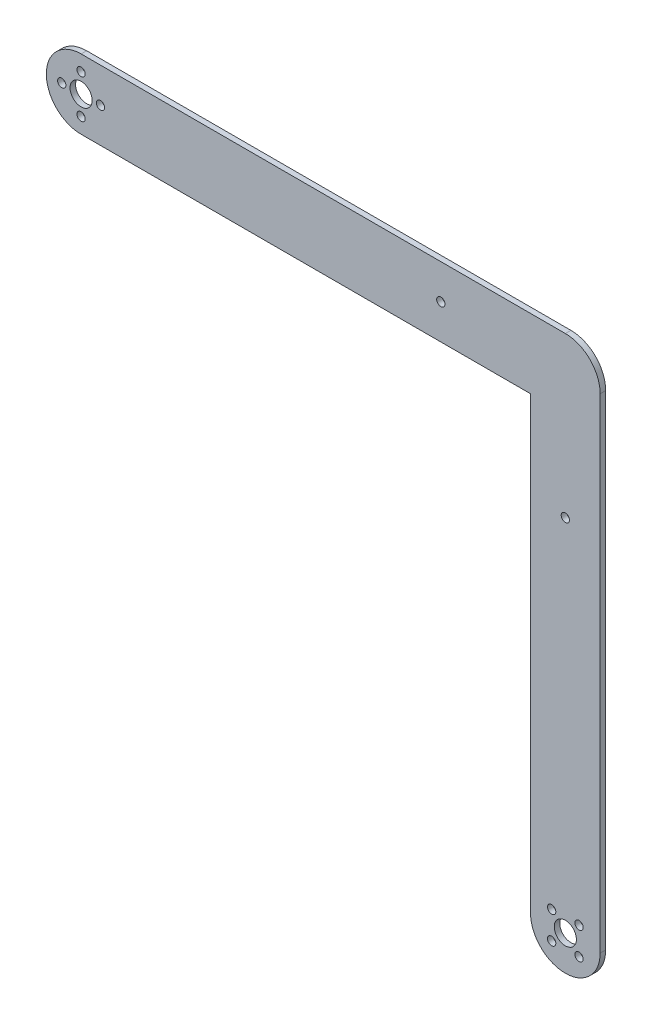
ISO-10303-21;
HEADER;
FILE_DESCRIPTION(('STEP AP214'),'2;1');
FILE_NAME('part.step','',(''),(''),'','','');
FILE_SCHEMA(('AUTOMOTIVE_DESIGN { 1 0 10303 214 1 1 1 1 }'));
ENDSEC;
DATA;
#1=APPLICATION_CONTEXT('core data for automotive mechanical design processes');
#2=APPLICATION_PROTOCOL_DEFINITION('international standard','automotive_design',2000,#1);
#3=PRODUCT_CONTEXT('',#1,'mechanical');
#4=PRODUCT('Part','Part','',(#3));
#5=PRODUCT_RELATED_PRODUCT_CATEGORY('part','',(#4));
#6=PRODUCT_DEFINITION_FORMATION('','',#4);
#7=PRODUCT_DEFINITION_CONTEXT('part definition',#1,'design');
#8=PRODUCT_DEFINITION('design','',#6,#7);
#9=PRODUCT_DEFINITION_SHAPE('','',#8);
#10=(LENGTH_UNIT() NAMED_UNIT(*) SI_UNIT(.MILLI.,.METRE.));
#11=(NAMED_UNIT(*) PLANE_ANGLE_UNIT() SI_UNIT($,.RADIAN.));
#12=(NAMED_UNIT(*) SI_UNIT($,.STERADIAN.) SOLID_ANGLE_UNIT());
#13=UNCERTAINTY_MEASURE_WITH_UNIT(LENGTH_MEASURE(1.E-05),#10,'distance_accuracy_value','');
#14=(GEOMETRIC_REPRESENTATION_CONTEXT(3) GLOBAL_UNCERTAINTY_ASSIGNED_CONTEXT((#13)) GLOBAL_UNIT_ASSIGNED_CONTEXT((#10,
#11,#12)) REPRESENTATION_CONTEXT('',''));
#15=CARTESIAN_POINT('',(0.,0.,0.));
#16=DIRECTION('',(0.,0.,1.));
#17=DIRECTION('',(1.,0.,0.));
#18=AXIS2_PLACEMENT_3D('',#15,#16,#17);
#19=CARTESIAN_POINT('',(0.,0.,2.));
#20=DIRECTION('',(0.,0.,1.));
#21=DIRECTION('',(1.,0.,0.));
#22=AXIS2_PLACEMENT_3D('',#19,#20,#21);
#23=PLANE('',#22);
#24=CARTESIAN_POINT('',(-182.,175.07397032379,2.));
#25=DIRECTION('',(0.,0.,1.));
#26=DIRECTION('',(1.,0.,0.));
#27=AXIS2_PLACEMENT_3D('',#24,#25,#26);
#28=CIRCLE('',#27,1.5);
#29=CARTESIAN_POINT('',(-180.5,175.07397032379,2.));
#30=VERTEX_POINT('',#29);
#31=EDGE_CURVE('E266',#30,#30,#28,.T.);
#32=ORIENTED_EDGE('',*,*,#31,.F.);
#33=EDGE_LOOP('',(#32));
#34=FACE_BOUND('',#33,.T.);
#35=CARTESIAN_POINT('',(-168.,175.07397032379,2.));
#36=DIRECTION('',(0.,0.,1.));
#37=DIRECTION('',(1.,0.,0.));
#38=AXIS2_PLACEMENT_3D('',#35,#36,#37);
#39=CIRCLE('',#38,1.5);
#40=CARTESIAN_POINT('',(-166.5,175.07397032379,2.));
#41=VERTEX_POINT('',#40);
#42=EDGE_CURVE('E250',#41,#41,#39,.T.);
#43=ORIENTED_EDGE('',*,*,#42,.F.);
#44=EDGE_LOOP('',(#43));
#45=FACE_BOUND('',#44,.T.);
#46=CARTESIAN_POINT('',(-175.,182.07397032379,2.));
#47=DIRECTION('',(0.,0.,1.));
#48=DIRECTION('',(1.,0.,0.));
#49=AXIS2_PLACEMENT_3D('',#46,#47,#48);
#50=CIRCLE('',#49,1.5);
#51=CARTESIAN_POINT('',(-173.5,182.07397032379,2.));
#52=VERTEX_POINT('',#51);
#53=EDGE_CURVE('E234',#52,#52,#50,.T.);
#54=ORIENTED_EDGE('',*,*,#53,.F.);
#55=EDGE_LOOP('',(#54));
#56=FACE_BOUND('',#55,.T.);
#57=CARTESIAN_POINT('',(4.94974746830597,-4.94974746830583,2.));
#58=DIRECTION('',(0.,0.,1.));
#59=DIRECTION('',(1.,0.,0.));
#60=AXIS2_PLACEMENT_3D('',#57,#58,#59);
#61=CIRCLE('',#60,1.49999999999997);
#62=CARTESIAN_POINT('',(6.44974746830594,-4.94974746830583,2.));
#63=VERTEX_POINT('',#62);
#64=EDGE_CURVE('E218',#63,#63,#61,.T.);
#65=ORIENTED_EDGE('',*,*,#64,.F.);
#66=EDGE_LOOP('',(#65));
#67=FACE_BOUND('',#66,.T.);
#68=CARTESIAN_POINT('',(4.94974746830582,4.94974746830584,2.));
#69=DIRECTION('',(0.,0.,1.));
#70=DIRECTION('',(1.,0.,0.));
#71=AXIS2_PLACEMENT_3D('',#68,#69,#70);
#72=CIRCLE('',#71,1.5);
#73=CARTESIAN_POINT('',(6.44974746830583,4.94974746830584,2.));
#74=VERTEX_POINT('',#73);
#75=EDGE_CURVE('E202',#74,#74,#72,.T.);
#76=ORIENTED_EDGE('',*,*,#75,.F.);
#77=EDGE_LOOP('',(#76));
#78=FACE_BOUND('',#77,.T.);
#79=CARTESIAN_POINT('',(-175.,175.07397032379,2.));
#80=DIRECTION('',(0.,0.,1.));
#81=DIRECTION('',(1.,0.,0.));
#82=AXIS2_PLACEMENT_3D('',#79,#80,#81);
#83=CIRCLE('',#82,3.99999999999999);
#84=CARTESIAN_POINT('',(-171.,175.07397032379,2.));
#85=VERTEX_POINT('',#84);
#86=EDGE_CURVE('E142',#85,#85,#83,.T.);
#87=ORIENTED_EDGE('',*,*,#86,.F.);
#88=EDGE_LOOP('',(#87));
#89=FACE_BOUND('',#88,.T.);
#90=CARTESIAN_POINT('',(0.,0.,2.));
#91=DIRECTION('',(0.,0.,1.));
#92=DIRECTION('',(1.,0.,0.));
#93=AXIS2_PLACEMENT_3D('',#90,#91,#92);
#94=CIRCLE('',#93,12.5856838164723);
#95=CARTESIAN_POINT('',(-12.5856838164723,0.,2.));
#96=VERTEX_POINT('',#95);
#97=CARTESIAN_POINT('',(12.5856838164723,0.,2.));
#98=VERTEX_POINT('',#97);
#99=EDGE_CURVE('E157',#96,#98,#94,.T.);
#100=ORIENTED_EDGE('',*,*,#99,.T.);
#101=DIRECTION('',(0.,1.,0.));
#102=VECTOR('',#101,1.);
#103=CARTESIAN_POINT('',(12.5856838164723,175.07397032379,2.));
#104=LINE('',#103,#102);
#105=CARTESIAN_POINT('',(12.5856838164723,175.07397032379,2.));
#106=VERTEX_POINT('',#105);
#107=EDGE_CURVE('E99',#98,#106,#104,.T.);
#108=ORIENTED_EDGE('',*,*,#107,.T.);
#109=CARTESIAN_POINT('',(0.0117134926824747,175.07397032379,2.));
#110=DIRECTION('',(0.,0.,1.));
#111=DIRECTION('',(1.,0.,0.));
#112=AXIS2_PLACEMENT_3D('',#109,#110,#111);
#113=CIRCLE('',#112,12.5739703237898);
#114=CARTESIAN_POINT('',(0.0117134926824747,187.64794064758,2.));
#115=VERTEX_POINT('',#114);
#116=EDGE_CURVE('E174',#106,#115,#113,.T.);
#117=ORIENTED_EDGE('',*,*,#116,.T.);
#118=DIRECTION('',(-1.,0.,0.));
#119=VECTOR('',#118,1.);
#120=CARTESIAN_POINT('',(-175.,187.64794064758,2.));
#121=LINE('',#120,#119);
#122=CARTESIAN_POINT('',(-175.,187.64794064758,2.));
#123=VERTEX_POINT('',#122);
#124=EDGE_CURVE('E115',#115,#123,#121,.T.);
#125=ORIENTED_EDGE('',*,*,#124,.T.);
#126=CARTESIAN_POINT('',(-175.,175.07397032379,2.));
#127=DIRECTION('',(0.,0.,1.));
#128=DIRECTION('',(1.,0.,0.));
#129=AXIS2_PLACEMENT_3D('',#126,#127,#128);
#130=CIRCLE('',#129,12.5739703237898);
#131=CARTESIAN_POINT('',(-175.,162.5,2.));
#132=VERTEX_POINT('',#131);
#133=EDGE_CURVE('E109',#123,#132,#130,.T.);
#134=ORIENTED_EDGE('',*,*,#133,.T.);
#135=DIRECTION('',(1.,0.,0.));
#136=VECTOR('',#135,1.);
#137=CARTESIAN_POINT('',(-175.,162.5,2.));
#138=LINE('',#137,#136);
#139=CARTESIAN_POINT('',(-12.5856838164723,162.5,2.));
#140=VERTEX_POINT('',#139);
#141=EDGE_CURVE('E113',#132,#140,#138,.T.);
#142=ORIENTED_EDGE('',*,*,#141,.T.);
#143=DIRECTION('',(0.,-1.,0.));
#144=VECTOR('',#143,1.);
#145=CARTESIAN_POINT('',(-12.5856838164723,0.,2.));
#146=LINE('',#145,#144);
#147=EDGE_CURVE('E59',#140,#96,#146,.T.);
#148=ORIENTED_EDGE('',*,*,#147,.T.);
#149=EDGE_LOOP('',(#100,#108,#117,#125,#134,#142,#148));
#150=FACE_BOUND('',#149,.T.);
#151=CARTESIAN_POINT('',(0.,0.,2.));
#152=DIRECTION('',(0.,0.,1.));
#153=DIRECTION('',(1.,0.,0.));
#154=AXIS2_PLACEMENT_3D('',#151,#152,#153);
#155=CIRCLE('',#154,4.);
#156=CARTESIAN_POINT('',(4.,0.,2.));
#157=VERTEX_POINT('',#156);
#158=EDGE_CURVE('E194',#157,#157,#155,.T.);
#159=ORIENTED_EDGE('',*,*,#158,.F.);
#160=EDGE_LOOP('',(#159));
#161=FACE_BOUND('',#160,.T.);
#162=CARTESIAN_POINT('',(0.,130.,2.));
#163=DIRECTION('',(0.,0.,1.));
#164=DIRECTION('',(1.,0.,0.));
#165=AXIS2_PLACEMENT_3D('',#162,#163,#164);
#166=CIRCLE('',#165,1.5);
#167=CARTESIAN_POINT('',(1.5,130.,2.));
#168=VERTEX_POINT('',#167);
#169=EDGE_CURVE('E210',#168,#168,#166,.T.);
#170=ORIENTED_EDGE('',*,*,#169,.F.);
#171=EDGE_LOOP('',(#170));
#172=FACE_BOUND('',#171,.T.);
#173=CARTESIAN_POINT('',(-4.94974746830569,-4.94974746830598,2.));
#174=DIRECTION('',(0.,0.,1.));
#175=DIRECTION('',(1.,0.,0.));
#176=AXIS2_PLACEMENT_3D('',#173,#174,#175);
#177=CIRCLE('',#176,1.50000000000011);
#178=CARTESIAN_POINT('',(-3.44974746830558,-4.94974746830598,2.));
#179=VERTEX_POINT('',#178);
#180=EDGE_CURVE('E226',#179,#179,#177,.T.);
#181=ORIENTED_EDGE('',*,*,#180,.F.);
#182=EDGE_LOOP('',(#181));
#183=FACE_BOUND('',#182,.T.);
#184=CARTESIAN_POINT('',(-45.,175.07397032379,2.));
#185=DIRECTION('',(0.,0.,1.));
#186=DIRECTION('',(1.,0.,0.));
#187=AXIS2_PLACEMENT_3D('',#184,#185,#186);
#188=CIRCLE('',#187,1.5);
#189=CARTESIAN_POINT('',(-43.5,175.07397032379,2.));
#190=VERTEX_POINT('',#189);
#191=EDGE_CURVE('E242',#190,#190,#188,.T.);
#192=ORIENTED_EDGE('',*,*,#191,.F.);
#193=EDGE_LOOP('',(#192));
#194=FACE_BOUND('',#193,.T.);
#195=CARTESIAN_POINT('',(-175.,168.07397032379,2.));
#196=DIRECTION('',(0.,0.,1.));
#197=DIRECTION('',(1.,0.,0.));
#198=AXIS2_PLACEMENT_3D('',#195,#196,#197);
#199=CIRCLE('',#198,1.5);
#200=CARTESIAN_POINT('',(-173.5,168.07397032379,2.));
#201=VERTEX_POINT('',#200);
#202=EDGE_CURVE('E258',#201,#201,#199,.T.);
#203=ORIENTED_EDGE('',*,*,#202,.F.);
#204=EDGE_LOOP('',(#203));
#205=FACE_BOUND('',#204,.T.);
#206=CARTESIAN_POINT('',(-4.94974746830584,4.94974746830569,2.));
#207=DIRECTION('',(0.,0.,1.));
#208=DIRECTION('',(1.,0.,0.));
#209=AXIS2_PLACEMENT_3D('',#206,#207,#208);
#210=CIRCLE('',#209,1.50000000000016);
#211=CARTESIAN_POINT('',(-3.44974746830568,4.94974746830569,2.));
#212=VERTEX_POINT('',#211);
#213=EDGE_CURVE('E274',#212,#212,#210,.T.);
#214=ORIENTED_EDGE('',*,*,#213,.F.);
#215=EDGE_LOOP('',(#214));
#216=FACE_BOUND('',#215,.T.);
#217=ADVANCED_FACE('F41',(#34,#45,#56,#67,#78,#89,#150,#161,#172,#183,#194,#205,#216),#23,.T.);
#218=CARTESIAN_POINT('',(0.,0.,0.));
#219=DIRECTION('',(0.,0.,1.));
#220=DIRECTION('',(1.,0.,0.));
#221=AXIS2_PLACEMENT_3D('',#218,#219,#220);
#222=PLANE('',#221);
#223=CARTESIAN_POINT('',(0.,0.,0.));
#224=DIRECTION('',(0.,0.,1.));
#225=DIRECTION('',(1.,0.,0.));
#226=AXIS2_PLACEMENT_3D('',#223,#224,#225);
#227=CIRCLE('',#226,12.5856838164723);
#228=CARTESIAN_POINT('',(-12.5856838164723,0.,0.));
#229=VERTEX_POINT('',#228);
#230=CARTESIAN_POINT('',(12.5856838164723,0.,0.));
#231=VERTEX_POINT('',#230);
#232=EDGE_CURVE('E137',#229,#231,#227,.T.);
#233=ORIENTED_EDGE('',*,*,#232,.F.);
#234=DIRECTION('',(0.,-1.,0.));
#235=VECTOR('',#234,1.);
#236=CARTESIAN_POINT('',(-12.5856838164723,0.,0.));
#237=LINE('',#236,#235);
#238=CARTESIAN_POINT('',(-12.5856838164723,162.5,0.));
#239=VERTEX_POINT('',#238);
#240=EDGE_CURVE('E91',#239,#229,#237,.T.);
#241=ORIENTED_EDGE('',*,*,#240,.F.);
#242=DIRECTION('',(1.,0.,0.));
#243=VECTOR('',#242,1.);
#244=CARTESIAN_POINT('',(-175.,162.5,0.));
#245=LINE('',#244,#243);
#246=CARTESIAN_POINT('',(-175.,162.5,0.));
#247=VERTEX_POINT('',#246);
#248=EDGE_CURVE('E85',#247,#239,#245,.T.);
#249=ORIENTED_EDGE('',*,*,#248,.F.);
#250=CARTESIAN_POINT('',(-175.,175.07397032379,0.));
#251=DIRECTION('',(0.,0.,1.));
#252=DIRECTION('',(1.,0.,0.));
#253=AXIS2_PLACEMENT_3D('',#250,#251,#252);
#254=CIRCLE('',#253,12.5739703237898);
#255=CARTESIAN_POINT('',(-175.,187.64794064758,0.));
#256=VERTEX_POINT('',#255);
#257=EDGE_CURVE('E124',#256,#247,#254,.T.);
#258=ORIENTED_EDGE('',*,*,#257,.F.);
#259=DIRECTION('',(-1.,0.,0.));
#260=VECTOR('',#259,1.);
#261=CARTESIAN_POINT('',(-175.,187.64794064758,0.));
#262=LINE('',#261,#260);
#263=CARTESIAN_POINT('',(0.0117134926824747,187.64794064758,0.));
#264=VERTEX_POINT('',#263);
#265=EDGE_CURVE('E148',#264,#256,#262,.T.);
#266=ORIENTED_EDGE('',*,*,#265,.F.);
#267=CARTESIAN_POINT('',(0.0117134926824747,175.07397032379,0.));
#268=DIRECTION('',(0.,0.,1.));
#269=DIRECTION('',(1.,0.,0.));
#270=AXIS2_PLACEMENT_3D('',#267,#268,#269);
#271=CIRCLE('',#270,12.5739703237898);
#272=CARTESIAN_POINT('',(12.5856838164723,175.07397032379,0.));
#273=VERTEX_POINT('',#272);
#274=EDGE_CURVE('E145',#273,#264,#271,.T.);
#275=ORIENTED_EDGE('',*,*,#274,.F.);
#276=DIRECTION('',(0.,1.,0.));
#277=VECTOR('',#276,1.);
#278=CARTESIAN_POINT('',(12.5856838164723,175.07397032379,0.));
#279=LINE('',#278,#277);
#280=EDGE_CURVE('E141',#231,#273,#279,.T.);
#281=ORIENTED_EDGE('',*,*,#280,.F.);
#282=EDGE_LOOP('',(#233,#241,#249,#258,#266,#275,#281));
#283=FACE_BOUND('',#282,.T.);
#284=CARTESIAN_POINT('',(-175.,175.07397032379,0.));
#285=DIRECTION('',(0.,0.,1.));
#286=DIRECTION('',(1.,0.,0.));
#287=AXIS2_PLACEMENT_3D('',#284,#285,#286);
#288=CIRCLE('',#287,3.99999999999999);
#289=CARTESIAN_POINT('',(-171.,175.07397032379,0.));
#290=VERTEX_POINT('',#289);
#291=EDGE_CURVE('E190',#290,#290,#288,.T.);
#292=ORIENTED_EDGE('',*,*,#291,.T.);
#293=EDGE_LOOP('',(#292));
#294=FACE_BOUND('',#293,.T.);
#295=CARTESIAN_POINT('',(0.,0.,0.));
#296=DIRECTION('',(0.,0.,1.));
#297=DIRECTION('',(1.,0.,0.));
#298=AXIS2_PLACEMENT_3D('',#295,#296,#297);
#299=CIRCLE('',#298,4.);
#300=CARTESIAN_POINT('',(4.,0.,0.));
#301=VERTEX_POINT('',#300);
#302=EDGE_CURVE('E198',#301,#301,#299,.T.);
#303=ORIENTED_EDGE('',*,*,#302,.T.);
#304=EDGE_LOOP('',(#303));
#305=FACE_BOUND('',#304,.T.);
#306=CARTESIAN_POINT('',(4.94974746830582,4.94974746830584,0.));
#307=DIRECTION('',(0.,0.,1.));
#308=DIRECTION('',(1.,0.,0.));
#309=AXIS2_PLACEMENT_3D('',#306,#307,#308);
#310=CIRCLE('',#309,1.5);
#311=CARTESIAN_POINT('',(6.44974746830583,4.94974746830584,0.));
#312=VERTEX_POINT('',#311);
#313=EDGE_CURVE('E206',#312,#312,#310,.T.);
#314=ORIENTED_EDGE('',*,*,#313,.T.);
#315=EDGE_LOOP('',(#314));
#316=FACE_BOUND('',#315,.T.);
#317=CARTESIAN_POINT('',(0.,130.,0.));
#318=DIRECTION('',(0.,0.,1.));
#319=DIRECTION('',(1.,0.,0.));
#320=AXIS2_PLACEMENT_3D('',#317,#318,#319);
#321=CIRCLE('',#320,1.5);
#322=CARTESIAN_POINT('',(1.5,130.,0.));
#323=VERTEX_POINT('',#322);
#324=EDGE_CURVE('E214',#323,#323,#321,.T.);
#325=ORIENTED_EDGE('',*,*,#324,.T.);
#326=EDGE_LOOP('',(#325));
#327=FACE_BOUND('',#326,.T.);
#328=CARTESIAN_POINT('',(4.94974746830597,-4.94974746830583,0.));
#329=DIRECTION('',(0.,0.,1.));
#330=DIRECTION('',(1.,0.,0.));
#331=AXIS2_PLACEMENT_3D('',#328,#329,#330);
#332=CIRCLE('',#331,1.49999999999997);
#333=CARTESIAN_POINT('',(6.44974746830594,-4.94974746830583,0.));
#334=VERTEX_POINT('',#333);
#335=EDGE_CURVE('E222',#334,#334,#332,.T.);
#336=ORIENTED_EDGE('',*,*,#335,.T.);
#337=EDGE_LOOP('',(#336));
#338=FACE_BOUND('',#337,.T.);
#339=CARTESIAN_POINT('',(-4.94974746830569,-4.94974746830598,0.));
#340=DIRECTION('',(0.,0.,1.));
#341=DIRECTION('',(1.,0.,0.));
#342=AXIS2_PLACEMENT_3D('',#339,#340,#341);
#343=CIRCLE('',#342,1.50000000000011);
#344=CARTESIAN_POINT('',(-3.44974746830558,-4.94974746830598,0.));
#345=VERTEX_POINT('',#344);
#346=EDGE_CURVE('E230',#345,#345,#343,.T.);
#347=ORIENTED_EDGE('',*,*,#346,.T.);
#348=EDGE_LOOP('',(#347));
#349=FACE_BOUND('',#348,.T.);
#350=CARTESIAN_POINT('',(-175.,182.07397032379,0.));
#351=DIRECTION('',(0.,0.,1.));
#352=DIRECTION('',(1.,0.,0.));
#353=AXIS2_PLACEMENT_3D('',#350,#351,#352);
#354=CIRCLE('',#353,1.5);
#355=CARTESIAN_POINT('',(-173.5,182.07397032379,0.));
#356=VERTEX_POINT('',#355);
#357=EDGE_CURVE('E238',#356,#356,#354,.T.);
#358=ORIENTED_EDGE('',*,*,#357,.T.);
#359=EDGE_LOOP('',(#358));
#360=FACE_BOUND('',#359,.T.);
#361=CARTESIAN_POINT('',(-45.,175.07397032379,0.));
#362=DIRECTION('',(0.,0.,1.));
#363=DIRECTION('',(1.,0.,0.));
#364=AXIS2_PLACEMENT_3D('',#361,#362,#363);
#365=CIRCLE('',#364,1.5);
#366=CARTESIAN_POINT('',(-43.5,175.07397032379,0.));
#367=VERTEX_POINT('',#366);
#368=EDGE_CURVE('E246',#367,#367,#365,.T.);
#369=ORIENTED_EDGE('',*,*,#368,.T.);
#370=EDGE_LOOP('',(#369));
#371=FACE_BOUND('',#370,.T.);
#372=CARTESIAN_POINT('',(-168.,175.07397032379,0.));
#373=DIRECTION('',(0.,0.,1.));
#374=DIRECTION('',(1.,0.,0.));
#375=AXIS2_PLACEMENT_3D('',#372,#373,#374);
#376=CIRCLE('',#375,1.5);
#377=CARTESIAN_POINT('',(-166.5,175.07397032379,0.));
#378=VERTEX_POINT('',#377);
#379=EDGE_CURVE('E254',#378,#378,#376,.T.);
#380=ORIENTED_EDGE('',*,*,#379,.T.);
#381=EDGE_LOOP('',(#380));
#382=FACE_BOUND('',#381,.T.);
#383=CARTESIAN_POINT('',(-175.,168.07397032379,0.));
#384=DIRECTION('',(0.,0.,1.));
#385=DIRECTION('',(1.,0.,0.));
#386=AXIS2_PLACEMENT_3D('',#383,#384,#385);
#387=CIRCLE('',#386,1.5);
#388=CARTESIAN_POINT('',(-173.5,168.07397032379,0.));
#389=VERTEX_POINT('',#388);
#390=EDGE_CURVE('E262',#389,#389,#387,.T.);
#391=ORIENTED_EDGE('',*,*,#390,.T.);
#392=EDGE_LOOP('',(#391));
#393=FACE_BOUND('',#392,.T.);
#394=CARTESIAN_POINT('',(-182.,175.07397032379,0.));
#395=DIRECTION('',(0.,0.,1.));
#396=DIRECTION('',(1.,0.,0.));
#397=AXIS2_PLACEMENT_3D('',#394,#395,#396);
#398=CIRCLE('',#397,1.5);
#399=CARTESIAN_POINT('',(-180.5,175.07397032379,0.));
#400=VERTEX_POINT('',#399);
#401=EDGE_CURVE('E270',#400,#400,#398,.T.);
#402=ORIENTED_EDGE('',*,*,#401,.T.);
#403=EDGE_LOOP('',(#402));
#404=FACE_BOUND('',#403,.T.);
#405=CARTESIAN_POINT('',(-4.94974746830584,4.94974746830569,0.));
#406=DIRECTION('',(0.,0.,1.));
#407=DIRECTION('',(1.,0.,0.));
#408=AXIS2_PLACEMENT_3D('',#405,#406,#407);
#409=CIRCLE('',#408,1.50000000000016);
#410=CARTESIAN_POINT('',(-3.44974746830568,4.94974746830569,0.));
#411=VERTEX_POINT('',#410);
#412=EDGE_CURVE('E278',#411,#411,#409,.T.);
#413=ORIENTED_EDGE('',*,*,#412,.T.);
#414=EDGE_LOOP('',(#413));
#415=FACE_BOUND('',#414,.T.);
#416=ADVANCED_FACE('F178',(#283,#294,#305,#316,#327,#338,#349,#360,#371,#382,#393,#404,#415),
#222,.F.);
#417=CARTESIAN_POINT('',(0.,0.,2.));
#418=DIRECTION('',(0.,0.,-1.));
#419=DIRECTION('',(-1.,0.,0.));
#420=AXIS2_PLACEMENT_3D('',#417,#418,#419);
#421=CYLINDRICAL_SURFACE('',#420,12.5856838164723);
#422=ORIENTED_EDGE('',*,*,#232,.T.);
#423=DIRECTION('',(0.,0.,-1.));
#424=VECTOR('',#423,1.);
#425=CARTESIAN_POINT('',(12.5856838164723,0.,2.));
#426=LINE('',#425,#424);
#427=EDGE_CURVE('E11',#98,#231,#426,.T.);
#428=ORIENTED_EDGE('',*,*,#427,.F.);
#429=ORIENTED_EDGE('',*,*,#99,.F.);
#430=DIRECTION('',(0.,0.,-1.));
#431=VECTOR('',#430,1.);
#432=CARTESIAN_POINT('',(-12.5856838164723,0.,2.));
#433=LINE('',#432,#431);
#434=EDGE_CURVE('E133',#96,#229,#433,.T.);
#435=ORIENTED_EDGE('',*,*,#434,.T.);
#436=EDGE_LOOP('',(#422,#428,#429,#435));
#437=FACE_BOUND('',#436,.T.);
#438=ADVANCED_FACE('F43',(#437),#421,.T.);
#439=CARTESIAN_POINT('',(12.5856838164723,175.07397032379,2.));
#440=DIRECTION('',(-1.,0.,0.));
#441=DIRECTION('',(0.,-1.,0.));
#442=AXIS2_PLACEMENT_3D('',#439,#440,#441);
#443=PLANE('',#442);
#444=ORIENTED_EDGE('',*,*,#280,.T.);
#445=DIRECTION('',(0.,0.,-1.));
#446=VECTOR('',#445,1.);
#447=CARTESIAN_POINT('',(12.5856838164723,175.07397032379,2.));
#448=LINE('',#447,#446);
#449=EDGE_CURVE('E51',#106,#273,#448,.T.);
#450=ORIENTED_EDGE('',*,*,#449,.F.);
#451=ORIENTED_EDGE('',*,*,#107,.F.);
#452=ORIENTED_EDGE('',*,*,#427,.T.);
#453=EDGE_LOOP('',(#444,#450,#451,#452));
#454=FACE_BOUND('',#453,.T.);
#455=ADVANCED_FACE('F312',(#454),#443,.F.);
#456=CARTESIAN_POINT('',(0.0117134926824747,175.07397032379,2.));
#457=DIRECTION('',(0.,0.,-1.));
#458=DIRECTION('',(-1.,0.,0.));
#459=AXIS2_PLACEMENT_3D('',#456,#457,#458);
#460=CYLINDRICAL_SURFACE('',#459,12.5739703237898);
#461=ORIENTED_EDGE('',*,*,#274,.T.);
#462=DIRECTION('',(0.,0.,-1.));
#463=VECTOR('',#462,1.);
#464=CARTESIAN_POINT('',(0.0117134926824747,187.64794064758,2.));
#465=LINE('',#464,#463);
#466=EDGE_CURVE('E164',#115,#264,#465,.T.);
#467=ORIENTED_EDGE('',*,*,#466,.F.);
#468=ORIENTED_EDGE('',*,*,#116,.F.);
#469=ORIENTED_EDGE('',*,*,#449,.T.);
#470=EDGE_LOOP('',(#461,#467,#468,#469));
#471=FACE_BOUND('',#470,.T.);
#472=ADVANCED_FACE('F172',(#471),#460,.T.);
#473=CARTESIAN_POINT('',(-175.,187.64794064758,2.));
#474=DIRECTION('',(0.,-1.,0.));
#475=DIRECTION('',(1.,0.,0.));
#476=AXIS2_PLACEMENT_3D('',#473,#474,#475);
#477=PLANE('',#476);
#478=ORIENTED_EDGE('',*,*,#265,.T.);
#479=DIRECTION('',(0.,0.,-1.));
#480=VECTOR('',#479,1.);
#481=CARTESIAN_POINT('',(-175.,187.64794064758,2.));
#482=LINE('',#481,#480);
#483=EDGE_CURVE('E126',#123,#256,#482,.T.);
#484=ORIENTED_EDGE('',*,*,#483,.F.);
#485=ORIENTED_EDGE('',*,*,#124,.F.);
#486=ORIENTED_EDGE('',*,*,#466,.T.);
#487=EDGE_LOOP('',(#478,#484,#485,#486));
#488=FACE_BOUND('',#487,.T.);
#489=ADVANCED_FACE('F181',(#488),#477,.F.);
#490=CARTESIAN_POINT('',(-175.,175.07397032379,2.));
#491=DIRECTION('',(0.,0.,-1.));
#492=DIRECTION('',(-1.,0.,0.));
#493=AXIS2_PLACEMENT_3D('',#490,#491,#492);
#494=CYLINDRICAL_SURFACE('',#493,12.5739703237898);
#495=ORIENTED_EDGE('',*,*,#257,.T.);
#496=DIRECTION('',(0.,0.,-1.));
#497=VECTOR('',#496,1.);
#498=CARTESIAN_POINT('',(-175.,162.5,2.));
#499=LINE('',#498,#497);
#500=EDGE_CURVE('E121',#132,#247,#499,.T.);
#501=ORIENTED_EDGE('',*,*,#500,.F.);
#502=ORIENTED_EDGE('',*,*,#133,.F.);
#503=ORIENTED_EDGE('',*,*,#483,.T.);
#504=EDGE_LOOP('',(#495,#501,#502,#503));
#505=FACE_BOUND('',#504,.T.);
#506=ADVANCED_FACE('F122',(#505),#494,.T.);
#507=CARTESIAN_POINT('',(-175.,162.5,2.));
#508=DIRECTION('',(0.,1.,0.));
#509=DIRECTION('',(-1.,0.,0.));
#510=AXIS2_PLACEMENT_3D('',#507,#508,#509);
#511=PLANE('',#510);
#512=ORIENTED_EDGE('',*,*,#248,.T.);
#513=DIRECTION('',(0.,0.,-1.));
#514=VECTOR('',#513,1.);
#515=CARTESIAN_POINT('',(-12.5856838164723,162.5,2.));
#516=LINE('',#515,#514);
#517=EDGE_CURVE('E127',#140,#239,#516,.T.);
#518=ORIENTED_EDGE('',*,*,#517,.F.);
#519=ORIENTED_EDGE('',*,*,#141,.F.);
#520=ORIENTED_EDGE('',*,*,#500,.T.);
#521=EDGE_LOOP('',(#512,#518,#519,#520));
#522=FACE_BOUND('',#521,.T.);
#523=ADVANCED_FACE('F129',(#522),#511,.F.);
#524=CARTESIAN_POINT('',(-12.5856838164723,0.,2.));
#525=DIRECTION('',(1.,0.,0.));
#526=DIRECTION('',(0.,1.,0.));
#527=AXIS2_PLACEMENT_3D('',#524,#525,#526);
#528=PLANE('',#527);
#529=ORIENTED_EDGE('',*,*,#240,.T.);
#530=ORIENTED_EDGE('',*,*,#434,.F.);
#531=ORIENTED_EDGE('',*,*,#147,.F.);
#532=ORIENTED_EDGE('',*,*,#517,.T.);
#533=EDGE_LOOP('',(#529,#530,#531,#532));
#534=FACE_BOUND('',#533,.T.);
#535=ADVANCED_FACE('F302',(#534),#528,.F.);
#536=CARTESIAN_POINT('',(-175.,175.07397032379,2.));
#537=DIRECTION('',(0.,0.,-1.));
#538=DIRECTION('',(-1.,0.,0.));
#539=AXIS2_PLACEMENT_3D('',#536,#537,#538);
#540=CYLINDRICAL_SURFACE('',#539,3.99999999999999);
#541=ORIENTED_EDGE('',*,*,#86,.T.);
#542=EDGE_LOOP('',(#541));
#543=FACE_BOUND('',#542,.T.);
#544=ORIENTED_EDGE('',*,*,#291,.F.);
#545=EDGE_LOOP('',(#544));
#546=FACE_BOUND('',#545,.T.);
#547=ADVANCED_FACE('F299',(#543,#546),#540,.F.);
#548=CARTESIAN_POINT('',(0.,0.,2.));
#549=DIRECTION('',(0.,0.,-1.));
#550=DIRECTION('',(-1.,0.,0.));
#551=AXIS2_PLACEMENT_3D('',#548,#549,#550);
#552=CYLINDRICAL_SURFACE('',#551,4.);
#553=ORIENTED_EDGE('',*,*,#158,.T.);
#554=EDGE_LOOP('',(#553));
#555=FACE_BOUND('',#554,.T.);
#556=ORIENTED_EDGE('',*,*,#302,.F.);
#557=EDGE_LOOP('',(#556));
#558=FACE_BOUND('',#557,.T.);
#559=ADVANCED_FACE('F371',(#555,#558),#552,.F.);
#560=CARTESIAN_POINT('',(4.94974746830582,4.94974746830584,2.));
#561=DIRECTION('',(0.,0.,-1.));
#562=DIRECTION('',(-1.,0.,0.));
#563=AXIS2_PLACEMENT_3D('',#560,#561,#562);
#564=CYLINDRICAL_SURFACE('',#563,1.5);
#565=ORIENTED_EDGE('',*,*,#75,.T.);
#566=EDGE_LOOP('',(#565));
#567=FACE_BOUND('',#566,.T.);
#568=ORIENTED_EDGE('',*,*,#313,.F.);
#569=EDGE_LOOP('',(#568));
#570=FACE_BOUND('',#569,.T.);
#571=ADVANCED_FACE('F379',(#567,#570),#564,.F.);
#572=CARTESIAN_POINT('',(0.,130.,2.));
#573=DIRECTION('',(0.,0.,-1.));
#574=DIRECTION('',(-1.,0.,0.));
#575=AXIS2_PLACEMENT_3D('',#572,#573,#574);
#576=CYLINDRICAL_SURFACE('',#575,1.5);
#577=ORIENTED_EDGE('',*,*,#169,.T.);
#578=EDGE_LOOP('',(#577));
#579=FACE_BOUND('',#578,.T.);
#580=ORIENTED_EDGE('',*,*,#324,.F.);
#581=EDGE_LOOP('',(#580));
#582=FACE_BOUND('',#581,.T.);
#583=ADVANCED_FACE('F387',(#579,#582),#576,.F.);
#584=CARTESIAN_POINT('',(4.94974746830597,-4.94974746830583,2.));
#585=DIRECTION('',(0.,0.,-1.));
#586=DIRECTION('',(-1.,0.,0.));
#587=AXIS2_PLACEMENT_3D('',#584,#585,#586);
#588=CYLINDRICAL_SURFACE('',#587,1.49999999999997);
#589=ORIENTED_EDGE('',*,*,#64,.T.);
#590=EDGE_LOOP('',(#589));
#591=FACE_BOUND('',#590,.T.);
#592=ORIENTED_EDGE('',*,*,#335,.F.);
#593=EDGE_LOOP('',(#592));
#594=FACE_BOUND('',#593,.T.);
#595=ADVANCED_FACE('F396',(#591,#594),#588,.F.);
#596=CARTESIAN_POINT('',(-4.94974746830569,-4.94974746830598,2.));
#597=DIRECTION('',(0.,0.,-1.));
#598=DIRECTION('',(-1.,0.,0.));
#599=AXIS2_PLACEMENT_3D('',#596,#597,#598);
#600=CYLINDRICAL_SURFACE('',#599,1.50000000000011);
#601=ORIENTED_EDGE('',*,*,#180,.T.);
#602=EDGE_LOOP('',(#601));
#603=FACE_BOUND('',#602,.T.);
#604=ORIENTED_EDGE('',*,*,#346,.F.);
#605=EDGE_LOOP('',(#604));
#606=FACE_BOUND('',#605,.T.);
#607=ADVANCED_FACE('F405',(#603,#606),#600,.F.);
#608=CARTESIAN_POINT('',(-175.,182.07397032379,2.));
#609=DIRECTION('',(0.,0.,-1.));
#610=DIRECTION('',(-1.,0.,0.));
#611=AXIS2_PLACEMENT_3D('',#608,#609,#610);
#612=CYLINDRICAL_SURFACE('',#611,1.5);
#613=ORIENTED_EDGE('',*,*,#53,.T.);
#614=EDGE_LOOP('',(#613));
#615=FACE_BOUND('',#614,.T.);
#616=ORIENTED_EDGE('',*,*,#357,.F.);
#617=EDGE_LOOP('',(#616));
#618=FACE_BOUND('',#617,.T.);
#619=ADVANCED_FACE('F414',(#615,#618),#612,.F.);
#620=CARTESIAN_POINT('',(-45.,175.07397032379,2.));
#621=DIRECTION('',(0.,0.,-1.));
#622=DIRECTION('',(-1.,0.,0.));
#623=AXIS2_PLACEMENT_3D('',#620,#621,#622);
#624=CYLINDRICAL_SURFACE('',#623,1.5);
#625=ORIENTED_EDGE('',*,*,#191,.T.);
#626=EDGE_LOOP('',(#625));
#627=FACE_BOUND('',#626,.T.);
#628=ORIENTED_EDGE('',*,*,#368,.F.);
#629=EDGE_LOOP('',(#628));
#630=FACE_BOUND('',#629,.T.);
#631=ADVANCED_FACE('F423',(#627,#630),#624,.F.);
#632=CARTESIAN_POINT('',(-168.,175.07397032379,2.));
#633=DIRECTION('',(0.,0.,-1.));
#634=DIRECTION('',(-1.,0.,0.));
#635=AXIS2_PLACEMENT_3D('',#632,#633,#634);
#636=CYLINDRICAL_SURFACE('',#635,1.5);
#637=ORIENTED_EDGE('',*,*,#42,.T.);
#638=EDGE_LOOP('',(#637));
#639=FACE_BOUND('',#638,.T.);
#640=ORIENTED_EDGE('',*,*,#379,.F.);
#641=EDGE_LOOP('',(#640));
#642=FACE_BOUND('',#641,.T.);
#643=ADVANCED_FACE('F432',(#639,#642),#636,.F.);
#644=CARTESIAN_POINT('',(-175.,168.07397032379,2.));
#645=DIRECTION('',(0.,0.,-1.));
#646=DIRECTION('',(-1.,0.,0.));
#647=AXIS2_PLACEMENT_3D('',#644,#645,#646);
#648=CYLINDRICAL_SURFACE('',#647,1.5);
#649=ORIENTED_EDGE('',*,*,#202,.T.);
#650=EDGE_LOOP('',(#649));
#651=FACE_BOUND('',#650,.T.);
#652=ORIENTED_EDGE('',*,*,#390,.F.);
#653=EDGE_LOOP('',(#652));
#654=FACE_BOUND('',#653,.T.);
#655=ADVANCED_FACE('F441',(#651,#654),#648,.F.);
#656=CARTESIAN_POINT('',(-182.,175.07397032379,2.));
#657=DIRECTION('',(0.,0.,-1.));
#658=DIRECTION('',(-1.,0.,0.));
#659=AXIS2_PLACEMENT_3D('',#656,#657,#658);
#660=CYLINDRICAL_SURFACE('',#659,1.5);
#661=ORIENTED_EDGE('',*,*,#31,.T.);
#662=EDGE_LOOP('',(#661));
#663=FACE_BOUND('',#662,.T.);
#664=ORIENTED_EDGE('',*,*,#401,.F.);
#665=EDGE_LOOP('',(#664));
#666=FACE_BOUND('',#665,.T.);
#667=ADVANCED_FACE('F450',(#663,#666),#660,.F.);
#668=CARTESIAN_POINT('',(-4.94974746830584,4.94974746830569,2.));
#669=DIRECTION('',(0.,0.,-1.));
#670=DIRECTION('',(-1.,0.,0.));
#671=AXIS2_PLACEMENT_3D('',#668,#669,#670);
#672=CYLINDRICAL_SURFACE('',#671,1.50000000000016);
#673=ORIENTED_EDGE('',*,*,#213,.T.);
#674=EDGE_LOOP('',(#673));
#675=FACE_BOUND('',#674,.T.);
#676=ORIENTED_EDGE('',*,*,#412,.F.);
#677=EDGE_LOOP('',(#676));
#678=FACE_BOUND('',#677,.T.);
#679=ADVANCED_FACE('F286',(#675,#678),#672,.F.);
#680=CLOSED_SHELL('',(#217,#416,#438,#455,#472,#489,#506,#523,#535,#547,#559,#571,#583,#595,
#607,#619,#631,#643,#655,#667,#679));
#681=MANIFOLD_SOLID_BREP('B2',#680);
#682=ADVANCED_BREP_SHAPE_REPRESENTATION('',(#18,#681),#14);
#683=SHAPE_DEFINITION_REPRESENTATION(#9,#682);
ENDSEC;
END-ISO-10303-21;
